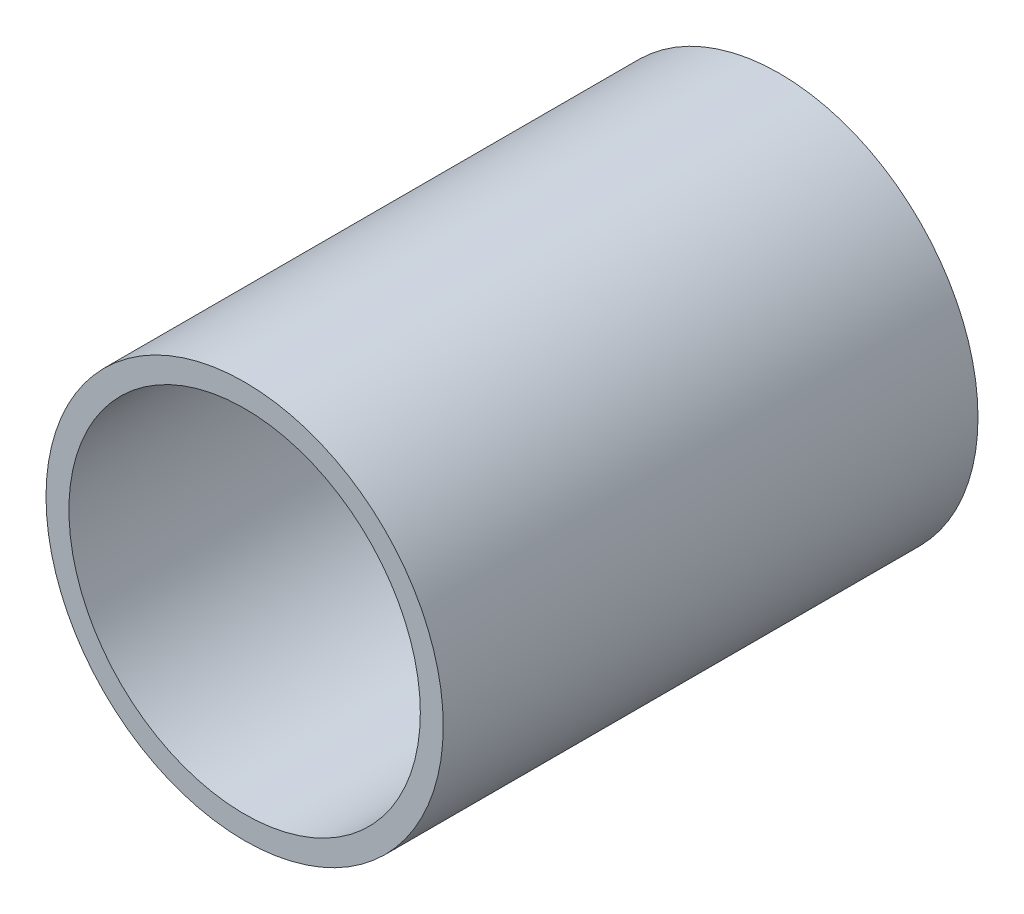
ISO-10303-21;
HEADER;
FILE_DESCRIPTION(('STEP AP214'),'2;1');
FILE_NAME('part.step','',(''),(''),'','','');
FILE_SCHEMA(('AUTOMOTIVE_DESIGN { 1 0 10303 214 1 1 1 1 }'));
ENDSEC;
DATA;
#1=APPLICATION_CONTEXT('core data for automotive mechanical design processes');
#2=APPLICATION_PROTOCOL_DEFINITION('international standard','automotive_design',2000,#1);
#3=PRODUCT_CONTEXT('',#1,'mechanical');
#4=PRODUCT('Part','Part','',(#3));
#5=PRODUCT_RELATED_PRODUCT_CATEGORY('part','',(#4));
#6=PRODUCT_DEFINITION_FORMATION('','',#4);
#7=PRODUCT_DEFINITION_CONTEXT('part definition',#1,'design');
#8=PRODUCT_DEFINITION('design','',#6,#7);
#9=PRODUCT_DEFINITION_SHAPE('','',#8);
#10=(LENGTH_UNIT() NAMED_UNIT(*) SI_UNIT(.MILLI.,.METRE.));
#11=(NAMED_UNIT(*) PLANE_ANGLE_UNIT() SI_UNIT($,.RADIAN.));
#12=(NAMED_UNIT(*) SI_UNIT($,.STERADIAN.) SOLID_ANGLE_UNIT());
#13=UNCERTAINTY_MEASURE_WITH_UNIT(LENGTH_MEASURE(1.E-05),#10,'distance_accuracy_value','');
#14=(GEOMETRIC_REPRESENTATION_CONTEXT(3) GLOBAL_UNCERTAINTY_ASSIGNED_CONTEXT((#13)) GLOBAL_UNIT_ASSIGNED_CONTEXT((#10,
#11,#12)) REPRESENTATION_CONTEXT('',''));
#15=CARTESIAN_POINT('',(0.,0.,0.));
#16=DIRECTION('',(0.,0.,1.));
#17=DIRECTION('',(1.,0.,0.));
#18=AXIS2_PLACEMENT_3D('',#15,#16,#17);
#19=CARTESIAN_POINT('',(0.,0.,70.));
#20=DIRECTION('',(0.,0.,-1.));
#21=DIRECTION('',(-1.,0.,0.));
#22=AXIS2_PLACEMENT_3D('',#19,#20,#21);
#23=CYLINDRICAL_SURFACE('',#22,26.);
#24=CARTESIAN_POINT('',(0.,0.,70.));
#25=DIRECTION('',(0.,0.,1.));
#26=DIRECTION('',(1.,0.,0.));
#27=AXIS2_PLACEMENT_3D('',#24,#25,#26);
#28=CIRCLE('',#27,26.);
#29=CARTESIAN_POINT('',(26.,0.,70.));
#30=VERTEX_POINT('',#29);
#31=EDGE_CURVE('E10',#30,#30,#28,.T.);
#32=ORIENTED_EDGE('',*,*,#31,.F.);
#33=EDGE_LOOP('',(#32));
#34=FACE_BOUND('',#33,.T.);
#35=CARTESIAN_POINT('',(0.,0.,0.));
#36=DIRECTION('',(0.,0.,1.));
#37=DIRECTION('',(1.,0.,0.));
#38=AXIS2_PLACEMENT_3D('',#35,#36,#37);
#39=CIRCLE('',#38,26.);
#40=CARTESIAN_POINT('',(26.,0.,0.));
#41=VERTEX_POINT('',#40);
#42=EDGE_CURVE('E38',#41,#41,#39,.T.);
#43=ORIENTED_EDGE('',*,*,#42,.T.);
#44=EDGE_LOOP('',(#43));
#45=FACE_BOUND('',#44,.T.);
#46=ADVANCED_FACE('F35',(#34,#45),#23,.T.);
#47=CARTESIAN_POINT('',(0.,0.,70.));
#48=DIRECTION('',(0.,0.,1.));
#49=DIRECTION('',(1.,0.,0.));
#50=AXIS2_PLACEMENT_3D('',#47,#48,#49);
#51=PLANE('',#50);
#52=CARTESIAN_POINT('',(0.,0.,70.));
#53=DIRECTION('',(0.,0.,1.));
#54=DIRECTION('',(1.,0.,0.));
#55=AXIS2_PLACEMENT_3D('',#52,#53,#54);
#56=CIRCLE('',#55,23.);
#57=CARTESIAN_POINT('',(23.,0.,70.));
#58=VERTEX_POINT('',#57);
#59=EDGE_CURVE('E49',#58,#58,#56,.T.);
#60=ORIENTED_EDGE('',*,*,#59,.F.);
#61=EDGE_LOOP('',(#60));
#62=FACE_BOUND('',#61,.T.);
#63=ORIENTED_EDGE('',*,*,#31,.T.);
#64=EDGE_LOOP('',(#63));
#65=FACE_BOUND('',#64,.T.);
#66=ADVANCED_FACE('F56',(#62,#65),#51,.T.);
#67=CARTESIAN_POINT('',(0.,0.,0.));
#68=DIRECTION('',(0.,0.,1.));
#69=DIRECTION('',(1.,0.,0.));
#70=AXIS2_PLACEMENT_3D('',#67,#68,#69);
#71=PLANE('',#70);
#72=CARTESIAN_POINT('',(0.,0.,0.));
#73=DIRECTION('',(0.,0.,1.));
#74=DIRECTION('',(1.,0.,0.));
#75=AXIS2_PLACEMENT_3D('',#72,#73,#74);
#76=CIRCLE('',#75,23.);
#77=CARTESIAN_POINT('',(23.,0.,0.));
#78=VERTEX_POINT('',#77);
#79=EDGE_CURVE('E45',#78,#78,#76,.F.);
#80=ORIENTED_EDGE('',*,*,#79,.F.);
#81=EDGE_LOOP('',(#80));
#82=FACE_BOUND('',#81,.T.);
#83=ORIENTED_EDGE('',*,*,#42,.F.);
#84=EDGE_LOOP('',(#83));
#85=FACE_BOUND('',#84,.T.);
#86=ADVANCED_FACE('F58',(#82,#85),#71,.F.);
#87=CARTESIAN_POINT('',(0.,0.,-0.001000000000001));
#88=DIRECTION('',(0.,0.,1.));
#89=DIRECTION('',(1.,0.,0.));
#90=AXIS2_PLACEMENT_3D('',#87,#88,#89);
#91=CYLINDRICAL_SURFACE('',#90,23.);
#92=ORIENTED_EDGE('',*,*,#59,.T.);
#93=EDGE_LOOP('',(#92));
#94=FACE_BOUND('',#93,.T.);
#95=ORIENTED_EDGE('',*,*,#79,.T.);
#96=EDGE_LOOP('',(#95));
#97=FACE_BOUND('',#96,.T.);
#98=ADVANCED_FACE('F53',(#94,#97),#91,.F.);
#99=CLOSED_SHELL('',(#46,#66,#86,#98));
#100=MANIFOLD_SOLID_BREP('B2',#99);
#101=ADVANCED_BREP_SHAPE_REPRESENTATION('',(#18,#100),#14);
#102=SHAPE_DEFINITION_REPRESENTATION(#9,#101);
ENDSEC;
END-ISO-10303-21;
